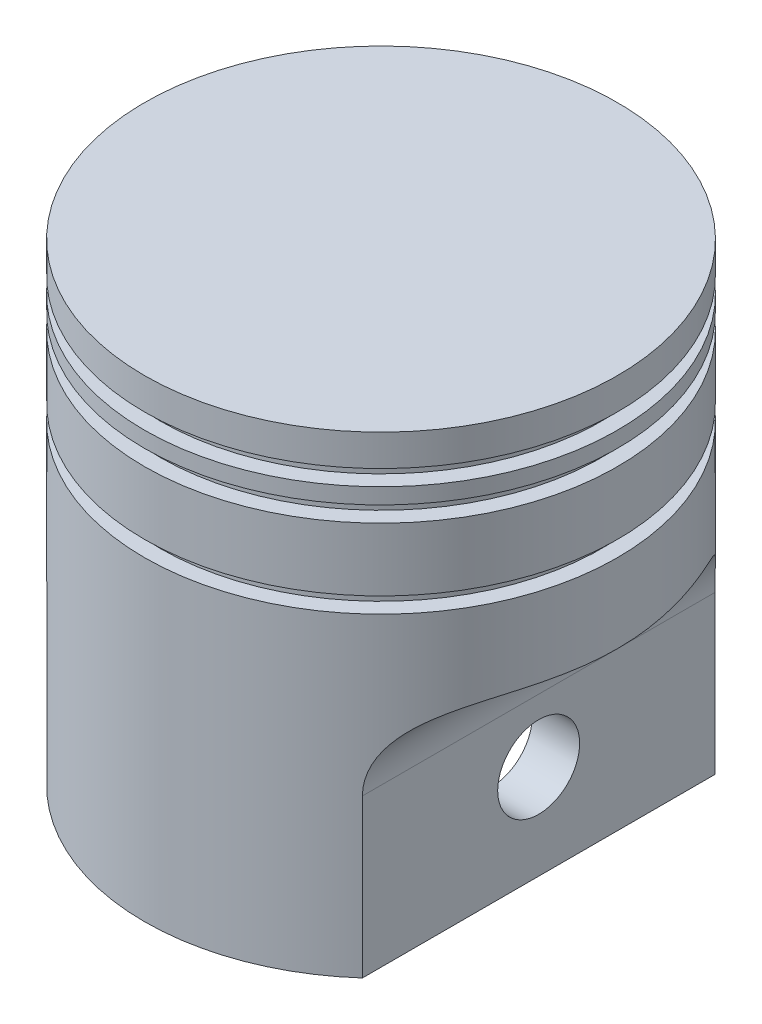
ISO-10303-21;
HEADER;
FILE_DESCRIPTION(('STEP AP214'),'2;1');
FILE_NAME('part.step','',(''),(''),'','','');
FILE_SCHEMA(('AUTOMOTIVE_DESIGN { 1 0 10303 214 1 1 1 1 }'));
ENDSEC;
DATA;
#1=APPLICATION_CONTEXT('core data for automotive mechanical design processes');
#2=APPLICATION_PROTOCOL_DEFINITION('international standard','automotive_design',2000,#1);
#3=PRODUCT_CONTEXT('',#1,'mechanical');
#4=PRODUCT('Part','Part','',(#3));
#5=PRODUCT_RELATED_PRODUCT_CATEGORY('part','',(#4));
#6=PRODUCT_DEFINITION_FORMATION('','',#4);
#7=PRODUCT_DEFINITION_CONTEXT('part definition',#1,'design');
#8=PRODUCT_DEFINITION('design','',#6,#7);
#9=PRODUCT_DEFINITION_SHAPE('','',#8);
#10=(LENGTH_UNIT() NAMED_UNIT(*) SI_UNIT(.MILLI.,.METRE.));
#11=(NAMED_UNIT(*) PLANE_ANGLE_UNIT() SI_UNIT($,.RADIAN.));
#12=(NAMED_UNIT(*) SI_UNIT($,.STERADIAN.) SOLID_ANGLE_UNIT());
#13=UNCERTAINTY_MEASURE_WITH_UNIT(LENGTH_MEASURE(1.E-05),#10,'distance_accuracy_value','');
#14=(GEOMETRIC_REPRESENTATION_CONTEXT(3) GLOBAL_UNCERTAINTY_ASSIGNED_CONTEXT((#13)) GLOBAL_UNIT_ASSIGNED_CONTEXT((#10,
#11,#12)) REPRESENTATION_CONTEXT('',''));
#15=CARTESIAN_POINT('',(0.,0.,0.));
#16=DIRECTION('',(0.,0.,1.));
#17=DIRECTION('',(1.,0.,0.));
#18=AXIS2_PLACEMENT_3D('',#15,#16,#17);
#19=CARTESIAN_POINT('',(0.,27.,0.));
#20=DIRECTION('',(0.,1.,0.));
#21=DIRECTION('',(0.,0.,1.));
#22=AXIS2_PLACEMENT_3D('',#19,#20,#21);
#23=CYLINDRICAL_SURFACE('',#22,14.);
#24=CARTESIAN_POINT('',(0.,27.,0.));
#25=DIRECTION('',(0.,1.,0.));
#26=DIRECTION('',(0.,0.,1.));
#27=AXIS2_PLACEMENT_3D('',#24,#25,#26);
#28=CIRCLE('',#27,14.);
#29=CARTESIAN_POINT('',(0.,27.,14.));
#30=VERTEX_POINT('',#29);
#31=EDGE_CURVE('E225',#30,#30,#28,.T.);
#32=ORIENTED_EDGE('',*,*,#31,.T.);
#33=EDGE_LOOP('',(#32));
#34=FACE_BOUND('',#33,.T.);
#35=CARTESIAN_POINT('',(0.,28.,0.));
#36=DIRECTION('',(0.,1.,0.));
#37=DIRECTION('',(0.,0.,1.));
#38=AXIS2_PLACEMENT_3D('',#35,#36,#37);
#39=CIRCLE('',#38,14.);
#40=CARTESIAN_POINT('',(0.,28.,14.));
#41=VERTEX_POINT('',#40);
#42=EDGE_CURVE('E216',#41,#41,#39,.T.);
#43=ORIENTED_EDGE('',*,*,#42,.F.);
#44=EDGE_LOOP('',(#43));
#45=FACE_BOUND('',#44,.T.);
#46=ADVANCED_FACE('F43',(#34,#45),#23,.T.);
#47=CARTESIAN_POINT('',(0.,26.,0.));
#48=DIRECTION('',(0.,1.,0.));
#49=DIRECTION('',(0.,0.,1.));
#50=AXIS2_PLACEMENT_3D('',#47,#48,#49);
#51=CYLINDRICAL_SURFACE('',#50,15.);
#52=CARTESIAN_POINT('',(0.,26.,0.));
#53=DIRECTION('',(0.,1.,0.));
#54=DIRECTION('',(0.,0.,1.));
#55=AXIS2_PLACEMENT_3D('',#52,#53,#54);
#56=CIRCLE('',#55,15.);
#57=CARTESIAN_POINT('',(0.,26.,15.));
#58=VERTEX_POINT('',#57);
#59=EDGE_CURVE('E240',#58,#58,#56,.T.);
#60=ORIENTED_EDGE('',*,*,#59,.T.);
#61=EDGE_LOOP('',(#60));
#62=FACE_BOUND('',#61,.T.);
#63=CARTESIAN_POINT('',(0.,27.,0.));
#64=DIRECTION('',(0.,1.,0.));
#65=DIRECTION('',(0.,0.,1.));
#66=AXIS2_PLACEMENT_3D('',#63,#64,#65);
#67=CIRCLE('',#66,15.);
#68=CARTESIAN_POINT('',(0.,27.,15.));
#69=VERTEX_POINT('',#68);
#70=EDGE_CURVE('E232',#69,#69,#67,.T.);
#71=ORIENTED_EDGE('',*,*,#70,.F.);
#72=EDGE_LOOP('',(#71));
#73=FACE_BOUND('',#72,.T.);
#74=ADVANCED_FACE('F336',(#62,#73),#51,.T.);
#75=CARTESIAN_POINT('',(0.,25.,0.));
#76=DIRECTION('',(0.,1.,0.));
#77=DIRECTION('',(0.,0.,1.));
#78=AXIS2_PLACEMENT_3D('',#75,#76,#77);
#79=CYLINDRICAL_SURFACE('',#78,14.);
#80=CARTESIAN_POINT('',(0.,25.,0.));
#81=DIRECTION('',(0.,1.,0.));
#82=DIRECTION('',(0.,0.,1.));
#83=AXIS2_PLACEMENT_3D('',#80,#81,#82);
#84=CIRCLE('',#83,14.);
#85=CARTESIAN_POINT('',(0.,25.,14.));
#86=VERTEX_POINT('',#85);
#87=EDGE_CURVE('E244',#86,#86,#84,.T.);
#88=ORIENTED_EDGE('',*,*,#87,.T.);
#89=EDGE_LOOP('',(#88));
#90=FACE_BOUND('',#89,.T.);
#91=CARTESIAN_POINT('',(0.,26.,0.));
#92=DIRECTION('',(0.,1.,0.));
#93=DIRECTION('',(0.,0.,1.));
#94=AXIS2_PLACEMENT_3D('',#91,#92,#93);
#95=CIRCLE('',#94,14.);
#96=CARTESIAN_POINT('',(0.,26.,14.));
#97=VERTEX_POINT('',#96);
#98=EDGE_CURVE('E236',#97,#97,#95,.T.);
#99=ORIENTED_EDGE('',*,*,#98,.F.);
#100=EDGE_LOOP('',(#99));
#101=FACE_BOUND('',#100,.T.);
#102=ADVANCED_FACE('F342',(#90,#101),#79,.T.);
#103=CARTESIAN_POINT('',(0.,21.,0.));
#104=DIRECTION('',(0.,1.,0.));
#105=DIRECTION('',(0.,0.,1.));
#106=AXIS2_PLACEMENT_3D('',#103,#104,#105);
#107=CYLINDRICAL_SURFACE('',#106,15.);
#108=CARTESIAN_POINT('',(0.,21.,0.));
#109=DIRECTION('',(0.,1.,0.));
#110=DIRECTION('',(0.,0.,1.));
#111=AXIS2_PLACEMENT_3D('',#108,#109,#110);
#112=CIRCLE('',#111,15.);
#113=CARTESIAN_POINT('',(0.,21.,15.));
#114=VERTEX_POINT('',#113);
#115=EDGE_CURVE('E256',#114,#114,#112,.T.);
#116=ORIENTED_EDGE('',*,*,#115,.T.);
#117=EDGE_LOOP('',(#116));
#118=FACE_BOUND('',#117,.T.);
#119=CARTESIAN_POINT('',(0.,25.,0.));
#120=DIRECTION('',(0.,1.,0.));
#121=DIRECTION('',(0.,0.,1.));
#122=AXIS2_PLACEMENT_3D('',#119,#120,#121);
#123=CIRCLE('',#122,15.);
#124=CARTESIAN_POINT('',(0.,25.,15.));
#125=VERTEX_POINT('',#124);
#126=EDGE_CURVE('E248',#125,#125,#123,.T.);
#127=ORIENTED_EDGE('',*,*,#126,.F.);
#128=EDGE_LOOP('',(#127));
#129=FACE_BOUND('',#128,.T.);
#130=ADVANCED_FACE('F361',(#118,#129),#107,.T.);
#131=CARTESIAN_POINT('',(0.,20.,0.));
#132=DIRECTION('',(0.,1.,0.));
#133=DIRECTION('',(0.,0.,1.));
#134=AXIS2_PLACEMENT_3D('',#131,#132,#133);
#135=CYLINDRICAL_SURFACE('',#134,14.);
#136=CARTESIAN_POINT('',(0.,20.,0.));
#137=DIRECTION('',(0.,1.,0.));
#138=DIRECTION('',(0.,0.,1.));
#139=AXIS2_PLACEMENT_3D('',#136,#137,#138);
#140=CIRCLE('',#139,14.);
#141=CARTESIAN_POINT('',(0.,20.,14.));
#142=VERTEX_POINT('',#141);
#143=EDGE_CURVE('E261',#142,#142,#140,.T.);
#144=ORIENTED_EDGE('',*,*,#143,.T.);
#145=EDGE_LOOP('',(#144));
#146=FACE_BOUND('',#145,.T.);
#147=CARTESIAN_POINT('',(0.,21.,0.));
#148=DIRECTION('',(0.,1.,0.));
#149=DIRECTION('',(0.,0.,1.));
#150=AXIS2_PLACEMENT_3D('',#147,#148,#149);
#151=CIRCLE('',#150,14.);
#152=CARTESIAN_POINT('',(0.,21.,14.));
#153=VERTEX_POINT('',#152);
#154=EDGE_CURVE('E252',#153,#153,#151,.T.);
#155=ORIENTED_EDGE('',*,*,#154,.F.);
#156=EDGE_LOOP('',(#155));
#157=FACE_BOUND('',#156,.T.);
#158=ADVANCED_FACE('F373',(#146,#157),#135,.T.);
#159=CARTESIAN_POINT('',(0.,30.,0.));
#160=DIRECTION('',(0.,-1.,0.));
#161=DIRECTION('',(0.,0.,-1.));
#162=AXIS2_PLACEMENT_3D('',#159,#160,#161);
#163=CYLINDRICAL_SURFACE('',#162,15.);
#164=DIRECTION('',(0.,-1.,0.));
#165=VECTOR('',#164,1.);
#166=CARTESIAN_POINT('',(-10.,30.,-11.180339887499));
#167=LINE('',#166,#165);
#168=CARTESIAN_POINT('',(-10.,0.,-11.180339887499));
#169=VERTEX_POINT('',#168);
#170=CARTESIAN_POINT('',(-10.,10.,-11.180339887499));
#171=VERTEX_POINT('',#170);
#172=EDGE_CURVE('E276',#169,#171,#167,.F.);
#173=ORIENTED_EDGE('',*,*,#172,.T.);
#174=CARTESIAN_POINT('',(-10.,10.,-11.180339887499));
#175=CARTESIAN_POINT('',(-9.99997565599701,10.1111993092333,-11.1803478124042));
#176=CARTESIAN_POINT('',(-10.0037085666472,10.2223906138013,-11.1770224635019));
#177=CARTESIAN_POINT('',(-10.0185100407903,10.4438514798812,-11.1637644984269));
#178=CARTESIAN_POINT('',(-10.0295761566512,10.5541213365173,-11.153834086847));
#179=CARTESIAN_POINT('',(-10.0587959121004,10.7723898234751,-11.127487863678));
#180=CARTESIAN_POINT('',(-10.0769156703676,10.8803967483549,-11.1111030506033));
#181=CARTESIAN_POINT('',(-10.1199097107303,11.093879673838,-11.0719590586056));
#182=CARTESIAN_POINT('',(-10.1447842434599,11.1993555803704,-11.049199643154));
#183=CARTESIAN_POINT('',(-10.2008270894416,11.4069405434256,-10.9974803677187));
#184=CARTESIAN_POINT('',(-10.2319888155767,11.509052994671,-10.9685269952689));
#185=CARTESIAN_POINT('',(-10.3000912129841,11.7094080399081,-10.9046001178019));
#186=CARTESIAN_POINT('',(-10.33703413764,11.8076491061492,-10.8696242648192));
#187=CARTESIAN_POINT('',(-10.4556821591037,12.0957592289541,-10.7559609312182));
#188=CARTESIAN_POINT('',(-10.545225384093,12.2790832004759,-10.6685206653911));
#189=CARTESIAN_POINT('',(-10.7436667476273,12.631789650879,-10.4687236611054));
#190=CARTESIAN_POINT('',(-10.8531976908455,12.8003167372623,-10.3555074075281));
#191=CARTESIAN_POINT('',(-11.0830623660803,13.113742625549,-10.1091082669942));
#192=CARTESIAN_POINT('',(-11.2034011745574,13.2586302330311,-9.97591597739786));
#193=CARTESIAN_POINT('',(-11.4203217963557,13.493580818861,-9.7260910173783));
#194=CARTESIAN_POINT('',(-11.5157960748233,13.5885078959772,-9.61298508048802));
#195=CARTESIAN_POINT('',(-11.7079391324749,13.7655546181643,-9.37801602557748));
#196=CARTESIAN_POINT('',(-11.8046083986064,13.8476688430907,-9.25614923317514));
#197=CARTESIAN_POINT('',(-11.997567817671,14.0000684363769,-9.00463956267724));
#198=CARTESIAN_POINT('',(-12.0938571688714,14.070335596837,-8.87498512299868));
#199=CARTESIAN_POINT('',(-12.2846005608556,14.1999886111455,-8.60903039807747));
#200=CARTESIAN_POINT('',(-12.3790539827797,14.2593708508505,-8.47272792442421));
#201=CARTESIAN_POINT('',(-12.6131046791401,14.3965316970471,-8.12243433112409));
#202=CARTESIAN_POINT('',(-12.7508152823734,14.4679656448217,-7.90468586923008));
#203=CARTESIAN_POINT('',(-13.0168890196464,14.5922591399893,-7.45843279627917));
#204=CARTESIAN_POINT('',(-13.1452470924153,14.6451086884634,-7.22992246978076));
#205=CARTESIAN_POINT('',(-13.3911570032563,14.7359095657273,-6.76362097433299));
#206=CARTESIAN_POINT('',(-13.5086819057701,14.7738244878829,-6.52580866056413));
#207=CARTESIAN_POINT('',(-13.7314513998452,14.8377901439596,-6.04300741296344));
#208=CARTESIAN_POINT('',(-13.8366967612395,14.863841621925,-5.79801893022829));
#209=CARTESIAN_POINT('',(-14.0091757345485,14.9014232582266,-5.36495307256899));
#210=CARTESIAN_POINT('',(-14.079284482172,14.9149602330253,-5.17818144635675));
#211=CARTESIAN_POINT('',(-14.2120698587301,14.9379850124174,-4.80176191822246));
#212=CARTESIAN_POINT('',(-14.2747457950028,14.9474724398482,-4.61211375009069));
#213=CARTESIAN_POINT('',(-14.4514265069636,14.9712473581493,-4.03929551413687));
#214=CARTESIAN_POINT('',(-14.5540441739598,14.9808398238309,-3.65235214126968));
#215=CARTESIAN_POINT('',(-14.7278867476447,14.9933457031787,-2.87210350727384));
#216=CARTESIAN_POINT('',(-14.7991598237735,14.9962693943766,-2.47880897764805));
#217=CARTESIAN_POINT('',(-14.9100636853889,14.9995021611041,-1.68796899448436));
#218=CARTESIAN_POINT('',(-14.9497153948407,14.9998129668905,-1.29042652862768));
#219=CARTESIAN_POINT('',(-14.9823059265745,14.99997299467,-0.743438803742464));
#220=CARTESIAN_POINT('',(-14.988945613787,14.9999894400308,-0.594711951186912));
#221=CARTESIAN_POINT('',(-14.9977891855319,15.0000017612852,-0.297328493152082));
#222=CARTESIAN_POINT('',(-14.9999990796937,14.9999976650728,-0.148672066407027));
#223=CARTESIAN_POINT('',(-15.,15.,0.));
#224=B_SPLINE_CURVE_WITH_KNOTS('',3,(#174,#175,#176,#177,#178,#179,#180,#181,#182,#183,#184,
#185,#186,#187,#188,#189,#190,#191,#192,#193,#194,#195,#196,#197,#198,#199,#200,#201,#202,#203,
#204,#205,#206,#207,#208,#209,#210,#211,#212,#213,#214,#215,#216,#217,#218,#219,#220,#221,#222,
#223),.UNSPECIFIED.,.F.,.F.,(4,2,2,2,2,2,2,2,2,2,2,2,2,2,2,2,2,2,2,2,2,2,2,2,4),(0.,
0.333473142708146,0.666835036830583,0.998615042230367,1.33040735991325,1.66185384594893,
1.99342984577352,2.65636670985117,3.34592324597871,4.03580537818995,4.56262937719034,
5.08967563473107,5.61752467468842,6.14554866126361,6.94635664053432,7.74759481970213,
8.55077429174956,9.35390338352502,9.95356817134691,10.5532887979478,11.7530540712473,
12.9509690824103,14.1480907699194,14.5946655256782,15.0406340296239),.UNSPECIFIED.);
#225=CARTESIAN_POINT('',(-15.,15.,0.));
#226=VERTEX_POINT('',#225);
#227=EDGE_CURVE('E11',#171,#226,#224,.T.);
#228=ORIENTED_EDGE('',*,*,#227,.T.);
#229=CARTESIAN_POINT('',(-15.,15.,0.));
#230=CARTESIAN_POINT('',(-15.0000027674631,14.9999751509739,0.209617565625922));
#231=CARTESIAN_POINT('',(-14.9956061492397,14.9999991364535,0.419234929773609));
#232=CARTESIAN_POINT('',(-14.9780339516588,14.9999661214073,0.838103171705837));
#233=CARTESIAN_POINT('',(-14.9648582973288,14.9999091201899,1.04735404634526));
#234=CARTESIAN_POINT('',(-14.9297326353317,14.9995353092622,1.4653005283991));
#235=CARTESIAN_POINT('',(-14.9077750388337,14.9992182745968,1.67399549801033));
#236=CARTESIAN_POINT('',(-14.8551254776945,14.9979705220127,2.09027771780069));
#237=CARTESIAN_POINT('',(-14.8244335711296,14.9970398081743,2.29786497533589));
#238=CARTESIAN_POINT('',(-14.7540544469088,14.9940726289193,2.71342728659697));
#239=CARTESIAN_POINT('',(-14.7142886613528,14.9920262747246,2.9213889777574));
#240=CARTESIAN_POINT('',(-14.625996824273,14.9861888341846,3.33541912398075));
#241=CARTESIAN_POINT('',(-14.5774708491015,14.9823977630454,3.54148759552819));
#242=CARTESIAN_POINT('',(-14.4717854101364,14.9723039572048,3.95122291548887));
#243=CARTESIAN_POINT('',(-14.4146306129257,14.966002577112,4.15489099826754));
#244=CARTESIAN_POINT('',(-14.2918084383066,14.9499794757418,4.55948545661232));
#245=CARTESIAN_POINT('',(-14.2261418808953,14.9402580837835,4.76041209422272));
#246=CARTESIAN_POINT('',(-14.0666259775899,14.9129531430872,5.21570301323769));
#247=CARTESIAN_POINT('',(-13.9700684986651,14.8939209904764,5.46904179504116));
#248=CARTESIAN_POINT('',(-13.7637266639418,14.8459104062024,5.96934121475423));
#249=CARTESIAN_POINT('',(-13.6539422591986,14.8169319377334,6.21630182905809));
#250=CARTESIAN_POINT('',(-13.4223985409493,14.7461333157217,6.70158382917697));
#251=CARTESIAN_POINT('',(-13.3006840255718,14.7043600393518,6.93993325825449));
#252=CARTESIAN_POINT('',(-13.0462517265084,14.6045132334209,7.40715622203951));
#253=CARTESIAN_POINT('',(-12.9135384032656,14.5464462890018,7.63603354213968));
#254=CARTESIAN_POINT('',(-12.6838162360167,14.4323744570191,8.00949767710657));
#255=CARTESIAN_POINT('',(-12.589248413754,14.3818518603149,8.15726911887295));
#256=CARTESIAN_POINT('',(-12.3969306401559,14.2704079323841,8.4466718681484));
#257=CARTESIAN_POINT('',(-12.2991815894325,14.2094895238607,8.58830488743232));
#258=CARTESIAN_POINT('',(-12.1016845325625,14.0760219167569,8.86442362508757));
#259=CARTESIAN_POINT('',(-12.0019378321413,14.0034801116028,8.99891381495299));
#260=CARTESIAN_POINT('',(-11.8019268188804,13.845590326216,9.25967396319291));
#261=CARTESIAN_POINT('',(-11.7016626586573,13.7602459343764,9.38594621077146));
#262=CARTESIAN_POINT('',(-11.4501262357414,13.5272123615156,9.6928711906204));
#263=CARTESIAN_POINT('',(-11.2996454747391,13.3702828297935,9.86736294084677));
#264=CARTESIAN_POINT('',(-11.0101631361557,13.021974729757,10.1893675913855));
#265=CARTESIAN_POINT('',(-10.8711484456694,12.8306363320486,10.3369115512679));
#266=CARTESIAN_POINT('',(-10.6353329304378,12.4477852201047,10.578921800732));
#267=CARTESIAN_POINT('',(-10.5353398193512,12.2612780787112,10.6781107010929));
#268=CARTESIAN_POINT('',(-10.4015182560002,11.9661350374956,10.8079735473173));
#269=CARTESIAN_POINT('',(-10.3596059652528,11.8651909867568,10.8481075520593));
#270=CARTESIAN_POINT('',(-10.2818565207815,11.6586954495324,10.9218264497697));
#271=CARTESIAN_POINT('',(-10.2460170024458,11.5531457766059,10.9554138926028));
#272=CARTESIAN_POINT('',(-10.1791495228189,11.3317472758129,11.0175827224958));
#273=CARTESIAN_POINT('',(-10.148530655595,11.2156583249168,11.0457513831275));
#274=CARTESIAN_POINT('',(-10.0954955911938,10.9800138106275,11.0942441308039));
#275=CARTESIAN_POINT('',(-10.0730793298693,10.8604582743522,11.1145682791958));
#276=CARTESIAN_POINT('',(-10.0368282382513,10.6180788604648,11.1473188414283));
#277=CARTESIAN_POINT('',(-10.0230567710812,10.4952375767744,11.1596869564662));
#278=CARTESIAN_POINT('',(-10.0046216347441,10.2482690619579,11.1762056281895));
#279=CARTESIAN_POINT('',(-9.99996226067655,10.1241412521104,11.1803523096115));
#280=CARTESIAN_POINT('',(-9.99999999999999,10.,11.180339887499));
#281=B_SPLINE_CURVE_WITH_KNOTS('',3,(#229,#230,#231,#232,#233,#234,#235,#236,#237,#238,#239,
#240,#241,#242,#243,#244,#245,#246,#247,#248,#249,#250,#251,#252,#253,#254,#255,#256,#257,#258,
#259,#260,#261,#262,#263,#264,#265,#266,#267,#268,#269,#270,#271,#272,#273,#274,#275,#276,#277,
#278,#279,#280),.UNSPECIFIED.,.F.,.F.,(4,2,2,2,2,2,2,2,2,2,2,2,2,2,2,2,2,2,2,2,2,2,2,2,2,4),(0.,
0.628806298726713,1.25761796751273,1.88697419598281,2.51632623982095,3.15134961921382,
3.78636746412054,4.42104310498472,5.05565764851537,5.8704593327851,6.68526403222074,
7.49711848142377,8.30864528828301,8.85599098651117,9.40318305542464,9.95002843736953,
10.4967208312954,11.3297750021383,12.16186286462,12.85974473502,13.208681272877,
13.5574816282876,13.9268787495009,14.2962729818332,14.6683440570941,15.0405904705005),.UNSPECIFIED.);
#282=CARTESIAN_POINT('',(-10.,10.,11.180339887499));
#283=VERTEX_POINT('',#282);
#284=EDGE_CURVE('E58',#226,#283,#281,.T.);
#285=ORIENTED_EDGE('',*,*,#284,.T.);
#286=DIRECTION('',(0.,-1.,0.));
#287=VECTOR('',#286,1.);
#288=CARTESIAN_POINT('',(-10.,30.,11.180339887499));
#289=LINE('',#288,#287);
#290=CARTESIAN_POINT('',(-10.,0.,11.180339887499));
#291=VERTEX_POINT('',#290);
#292=EDGE_CURVE('E279',#283,#291,#289,.T.);
#293=ORIENTED_EDGE('',*,*,#292,.T.);
#294=CARTESIAN_POINT('',(0.,0.,0.));
#295=DIRECTION('',(0.,1.,0.));
#296=DIRECTION('',(0.,0.,1.));
#297=AXIS2_PLACEMENT_3D('',#294,#295,#296);
#298=CIRCLE('',#297,15.);
#299=CARTESIAN_POINT('',(10.,0.,11.180339887499));
#300=VERTEX_POINT('',#299);
#301=EDGE_CURVE('E282',#291,#300,#298,.T.);
#302=ORIENTED_EDGE('',*,*,#301,.T.);
#303=DIRECTION('',(0.,-1.,0.));
#304=VECTOR('',#303,1.);
#305=CARTESIAN_POINT('',(10.,30.,11.180339887499));
#306=LINE('',#305,#304);
#307=CARTESIAN_POINT('',(10.,10.,11.180339887499));
#308=VERTEX_POINT('',#307);
#309=EDGE_CURVE('E270',#300,#308,#306,.F.);
#310=ORIENTED_EDGE('',*,*,#309,.T.);
#311=CARTESIAN_POINT('',(10.,10.,11.180339887499));
#312=CARTESIAN_POINT('',(9.99997565599701,10.1111993092333,11.1803478124042));
#313=CARTESIAN_POINT('',(10.0037085666472,10.2223906138013,11.1770224635019));
#314=CARTESIAN_POINT('',(10.0185100407903,10.4438514798812,11.1637644984269));
#315=CARTESIAN_POINT('',(10.0295761566512,10.5541213365173,11.153834086847));
#316=CARTESIAN_POINT('',(10.0587959121004,10.7723898234751,11.127487863678));
#317=CARTESIAN_POINT('',(10.0769156703676,10.8803967483549,11.1111030506033));
#318=CARTESIAN_POINT('',(10.1199097107303,11.093879673838,11.0719590586056));
#319=CARTESIAN_POINT('',(10.1447842434599,11.1993555803704,11.049199643154));
#320=CARTESIAN_POINT('',(10.2008270894416,11.4069405434256,10.9974803677187));
#321=CARTESIAN_POINT('',(10.2319888155767,11.509052994671,10.9685269952689));
#322=CARTESIAN_POINT('',(10.3000912129841,11.7094080399081,10.9046001178019));
#323=CARTESIAN_POINT('',(10.33703413764,11.8076491061492,10.8696242648192));
#324=CARTESIAN_POINT('',(10.4556821591037,12.0957592289541,10.7559609312182));
#325=CARTESIAN_POINT('',(10.545225384093,12.2790832004759,10.6685206653911));
#326=CARTESIAN_POINT('',(10.7436667476273,12.631789650879,10.4687236611054));
#327=CARTESIAN_POINT('',(10.8531976908455,12.8003167372623,10.3555074075281));
#328=CARTESIAN_POINT('',(11.0830623660803,13.113742625549,10.1091082669942));
#329=CARTESIAN_POINT('',(11.2034011745574,13.2586302330311,9.97591597739786));
#330=CARTESIAN_POINT('',(11.4203217963557,13.493580818861,9.7260910173783));
#331=CARTESIAN_POINT('',(11.5157960748233,13.5885078959772,9.61298508048802));
#332=CARTESIAN_POINT('',(11.7079391324749,13.7655546181643,9.37801602557748));
#333=CARTESIAN_POINT('',(11.8046083986064,13.8476688430907,9.25614923317514));
#334=CARTESIAN_POINT('',(11.997567817671,14.0000684363769,9.00463956267724));
#335=CARTESIAN_POINT('',(12.0938571688714,14.070335596837,8.87498512299868));
#336=CARTESIAN_POINT('',(12.2846005608556,14.1999886111455,8.60903039807747));
#337=CARTESIAN_POINT('',(12.3790539827797,14.2593708508505,8.47272792442421));
#338=CARTESIAN_POINT('',(12.6131046791401,14.3965316970471,8.12243433112409));
#339=CARTESIAN_POINT('',(12.7508152823734,14.4679656448217,7.90468586923008));
#340=CARTESIAN_POINT('',(13.0168890196464,14.5922591399893,7.45843279627917));
#341=CARTESIAN_POINT('',(13.1452470924153,14.6451086884634,7.22992246978076));
#342=CARTESIAN_POINT('',(13.3911570032563,14.7359095657273,6.76362097433299));
#343=CARTESIAN_POINT('',(13.5086819057701,14.7738244878829,6.52580866056413));
#344=CARTESIAN_POINT('',(13.7314513998452,14.8377901439596,6.04300741296344));
#345=CARTESIAN_POINT('',(13.8366967612395,14.863841621925,5.79801893022829));
#346=CARTESIAN_POINT('',(14.0091757345485,14.9014232582266,5.36495307256899));
#347=CARTESIAN_POINT('',(14.079284482172,14.9149602330253,5.17818144635675));
#348=CARTESIAN_POINT('',(14.2120698587301,14.9379850124174,4.80176191822246));
#349=CARTESIAN_POINT('',(14.2747457950028,14.9474724398482,4.61211375009069));
#350=CARTESIAN_POINT('',(14.4514265069636,14.9712473581493,4.03929551413687));
#351=CARTESIAN_POINT('',(14.5540441739598,14.9808398238309,3.65235214126968));
#352=CARTESIAN_POINT('',(14.7278867476447,14.9933457031787,2.87210350727384));
#353=CARTESIAN_POINT('',(14.7991598237735,14.9962693943766,2.47880897764805));
#354=CARTESIAN_POINT('',(14.9100636853889,14.9995021611041,1.68796899448436));
#355=CARTESIAN_POINT('',(14.9497153948407,14.9998129668905,1.29042652862768));
#356=CARTESIAN_POINT('',(14.9823059265745,14.99997299467,0.743438803742464));
#357=CARTESIAN_POINT('',(14.988945613787,14.9999894400308,0.594711951186912));
#358=CARTESIAN_POINT('',(14.9977891855319,15.0000017612852,0.297328493152082));
#359=CARTESIAN_POINT('',(14.9999990796937,14.9999976650728,0.148672066407027));
#360=CARTESIAN_POINT('',(15.,15.,0.));
#361=B_SPLINE_CURVE_WITH_KNOTS('',3,(#311,#312,#313,#314,#315,#316,#317,#318,#319,#320,#321,
#322,#323,#324,#325,#326,#327,#328,#329,#330,#331,#332,#333,#334,#335,#336,#337,#338,#339,#340,
#341,#342,#343,#344,#345,#346,#347,#348,#349,#350,#351,#352,#353,#354,#355,#356,#357,#358,#359,
#360),.UNSPECIFIED.,.F.,.F.,(4,2,2,2,2,2,2,2,2,2,2,2,2,2,2,2,2,2,2,2,2,2,2,2,4),(0.,
0.333473142708146,0.666835036830583,0.998615042230367,1.33040735991325,1.66185384594893,
1.99342984577352,2.65636670985117,3.34592324597871,4.03580537818995,4.56262937719034,
5.08967563473107,5.61752467468842,6.14554866126361,6.94635664053432,7.74759481970213,
8.55077429174956,9.35390338352502,9.95356817134691,10.5532887979478,11.7530540712473,
12.9509690824103,14.1480907699194,14.5946655256782,15.0406340296239),.UNSPECIFIED.);
#362=CARTESIAN_POINT('',(15.,15.,0.));
#363=VERTEX_POINT('',#362);
#364=EDGE_CURVE('E70',#308,#363,#361,.T.);
#365=ORIENTED_EDGE('',*,*,#364,.T.);
#366=CARTESIAN_POINT('',(15.,15.,0.));
#367=CARTESIAN_POINT('',(15.0000027674631,14.9999751509739,-0.209617565625922));
#368=CARTESIAN_POINT('',(14.9956061492397,14.9999991364535,-0.419234929773609));
#369=CARTESIAN_POINT('',(14.9780339516588,14.9999661214073,-0.838103171705837));
#370=CARTESIAN_POINT('',(14.9648582973288,14.9999091201899,-1.04735404634526));
#371=CARTESIAN_POINT('',(14.9297326353317,14.9995353092622,-1.4653005283991));
#372=CARTESIAN_POINT('',(14.9077750388337,14.9992182745968,-1.67399549801033));
#373=CARTESIAN_POINT('',(14.8551254776945,14.9979705220127,-2.09027771780069));
#374=CARTESIAN_POINT('',(14.8244335711296,14.9970398081743,-2.29786497533589));
#375=CARTESIAN_POINT('',(14.7540544469088,14.9940726289193,-2.71342728659697));
#376=CARTESIAN_POINT('',(14.7142886613528,14.9920262747246,-2.9213889777574));
#377=CARTESIAN_POINT('',(14.625996824273,14.9861888341846,-3.33541912398075));
#378=CARTESIAN_POINT('',(14.5774708491015,14.9823977630454,-3.54148759552819));
#379=CARTESIAN_POINT('',(14.4717854101364,14.9723039572048,-3.95122291548887));
#380=CARTESIAN_POINT('',(14.4146306129257,14.966002577112,-4.15489099826754));
#381=CARTESIAN_POINT('',(14.2918084383066,14.9499794757418,-4.55948545661232));
#382=CARTESIAN_POINT('',(14.2261418808953,14.9402580837835,-4.76041209422272));
#383=CARTESIAN_POINT('',(14.0666259775899,14.9129531430872,-5.21570301323769));
#384=CARTESIAN_POINT('',(13.9700684986651,14.8939209904764,-5.46904179504116));
#385=CARTESIAN_POINT('',(13.7637266639418,14.8459104062024,-5.96934121475423));
#386=CARTESIAN_POINT('',(13.6539422591986,14.8169319377334,-6.21630182905809));
#387=CARTESIAN_POINT('',(13.4223985409493,14.7461333157217,-6.70158382917697));
#388=CARTESIAN_POINT('',(13.3006840255718,14.7043600393518,-6.93993325825449));
#389=CARTESIAN_POINT('',(13.0462517265084,14.6045132334209,-7.40715622203951));
#390=CARTESIAN_POINT('',(12.9135384032656,14.5464462890018,-7.63603354213968));
#391=CARTESIAN_POINT('',(12.6838162360167,14.4323744570191,-8.00949767710657));
#392=CARTESIAN_POINT('',(12.589248413754,14.3818518603149,-8.15726911887295));
#393=CARTESIAN_POINT('',(12.3969306401559,14.2704079323841,-8.4466718681484));
#394=CARTESIAN_POINT('',(12.2991815894325,14.2094895238607,-8.58830488743232));
#395=CARTESIAN_POINT('',(12.1016845325625,14.0760219167569,-8.86442362508757));
#396=CARTESIAN_POINT('',(12.0019378321413,14.0034801116028,-8.99891381495299));
#397=CARTESIAN_POINT('',(11.8019268188804,13.845590326216,-9.25967396319291));
#398=CARTESIAN_POINT('',(11.7016626586573,13.7602459343764,-9.38594621077146));
#399=CARTESIAN_POINT('',(11.4501262357414,13.5272123615156,-9.6928711906204));
#400=CARTESIAN_POINT('',(11.2996454747391,13.3702828297935,-9.86736294084677));
#401=CARTESIAN_POINT('',(11.0101631361557,13.021974729757,-10.1893675913855));
#402=CARTESIAN_POINT('',(10.8711484456694,12.8306363320486,-10.3369115512679));
#403=CARTESIAN_POINT('',(10.6353329304378,12.4477852201047,-10.578921800732));
#404=CARTESIAN_POINT('',(10.5353398193512,12.2612780787112,-10.6781107010929));
#405=CARTESIAN_POINT('',(10.4015182560002,11.9661350374956,-10.8079735473173));
#406=CARTESIAN_POINT('',(10.3596059652528,11.8651909867568,-10.8481075520593));
#407=CARTESIAN_POINT('',(10.2818565207815,11.6586954495324,-10.9218264497697));
#408=CARTESIAN_POINT('',(10.2460170024458,11.5531457766059,-10.9554138926028));
#409=CARTESIAN_POINT('',(10.1791495228189,11.3317472758129,-11.0175827224958));
#410=CARTESIAN_POINT('',(10.148530655595,11.2156583249168,-11.0457513831275));
#411=CARTESIAN_POINT('',(10.0954955911938,10.9800138106275,-11.0942441308039));
#412=CARTESIAN_POINT('',(10.0730793298693,10.8604582743522,-11.1145682791958));
#413=CARTESIAN_POINT('',(10.0368282382513,10.6180788604648,-11.1473188414283));
#414=CARTESIAN_POINT('',(10.0230567710812,10.4952375767744,-11.1596869564662));
#415=CARTESIAN_POINT('',(10.0046216347441,10.2482690619579,-11.1762056281895));
#416=CARTESIAN_POINT('',(9.99996226067655,10.1241412521104,-11.1803523096115));
#417=CARTESIAN_POINT('',(9.99999999999999,10.,-11.180339887499));
#418=B_SPLINE_CURVE_WITH_KNOTS('',3,(#366,#367,#368,#369,#370,#371,#372,#373,#374,#375,#376,
#377,#378,#379,#380,#381,#382,#383,#384,#385,#386,#387,#388,#389,#390,#391,#392,#393,#394,#395,
#396,#397,#398,#399,#400,#401,#402,#403,#404,#405,#406,#407,#408,#409,#410,#411,#412,#413,#414,
#415,#416,#417),.UNSPECIFIED.,.F.,.F.,(4,2,2,2,2,2,2,2,2,2,2,2,2,2,2,2,2,2,2,2,2,2,2,2,2,4),(0.,
0.628806298726713,1.25761796751273,1.88697419598281,2.51632623982095,3.15134961921382,
3.78636746412054,4.42104310498472,5.05565764851537,5.8704593327851,6.68526403222074,
7.49711848142377,8.30864528828301,8.85599098651117,9.40318305542464,9.95002843736953,
10.4967208312954,11.3297750021383,12.16186286462,12.85974473502,13.208681272877,
13.5574816282876,13.9268787495009,14.2962729818332,14.6683440570941,15.0405904705005),.UNSPECIFIED.);
#419=CARTESIAN_POINT('',(10.,10.,-11.180339887499));
#420=VERTEX_POINT('',#419);
#421=EDGE_CURVE('E312',#363,#420,#418,.T.);
#422=ORIENTED_EDGE('',*,*,#421,.T.);
#423=DIRECTION('',(0.,-1.,0.));
#424=VECTOR('',#423,1.);
#425=CARTESIAN_POINT('',(10.,30.,-11.180339887499));
#426=LINE('',#425,#424);
#427=CARTESIAN_POINT('',(10.,0.,-11.180339887499));
#428=VERTEX_POINT('',#427);
#429=EDGE_CURVE('E273',#420,#428,#426,.T.);
#430=ORIENTED_EDGE('',*,*,#429,.T.);
#431=EDGE_CURVE('E286',#428,#169,#298,.T.);
#432=ORIENTED_EDGE('',*,*,#431,.T.);
#433=EDGE_LOOP('',(#173,#228,#285,#293,#302,#310,#365,#422,#430,#432));
#434=FACE_BOUND('',#433,.T.);
#435=CARTESIAN_POINT('',(0.,20.,0.));
#436=DIRECTION('',(0.,1.,0.));
#437=DIRECTION('',(0.,0.,1.));
#438=AXIS2_PLACEMENT_3D('',#435,#436,#437);
#439=CIRCLE('',#438,15.);
#440=CARTESIAN_POINT('',(0.,20.,15.));
#441=VERTEX_POINT('',#440);
#442=EDGE_CURVE('E260',#441,#441,#439,.T.);
#443=ORIENTED_EDGE('',*,*,#442,.F.);
#444=EDGE_LOOP('',(#443));
#445=FACE_BOUND('',#444,.T.);
#446=ADVANCED_FACE('F317',(#434,#445),#163,.T.);
#447=CARTESIAN_POINT('',(0.,0.,0.));
#448=DIRECTION('',(0.,1.,0.));
#449=DIRECTION('',(0.,0.,1.));
#450=AXIS2_PLACEMENT_3D('',#447,#448,#449);
#451=PLANE('',#450);
#452=DIRECTION('',(0.,0.,-1.));
#453=VECTOR('',#452,1.);
#454=CARTESIAN_POINT('',(-7.,0.,0.));
#455=LINE('',#454,#453);
#456=CARTESIAN_POINT('',(-7.,0.,9.74679434480896));
#457=VERTEX_POINT('',#456);
#458=CARTESIAN_POINT('',(-7.,0.,-9.74679434480896));
#459=VERTEX_POINT('',#458);
#460=EDGE_CURVE('E147',#457,#459,#455,.T.);
#461=ORIENTED_EDGE('',*,*,#460,.F.);
#462=CARTESIAN_POINT('',(0.,0.,0.));
#463=DIRECTION('',(0.,1.,0.));
#464=DIRECTION('',(0.,0.,1.));
#465=AXIS2_PLACEMENT_3D('',#462,#463,#464);
#466=CIRCLE('',#465,12.);
#467=CARTESIAN_POINT('',(7.,0.,9.74679434480896));
#468=VERTEX_POINT('',#467);
#469=EDGE_CURVE('E155',#457,#468,#466,.T.);
#470=ORIENTED_EDGE('',*,*,#469,.T.);
#471=DIRECTION('',(0.,0.,1.));
#472=VECTOR('',#471,1.);
#473=CARTESIAN_POINT('',(7.,0.,0.));
#474=LINE('',#473,#472);
#475=CARTESIAN_POINT('',(7.,0.,-9.74679434480896));
#476=VERTEX_POINT('',#475);
#477=EDGE_CURVE('E172',#476,#468,#474,.T.);
#478=ORIENTED_EDGE('',*,*,#477,.F.);
#479=CARTESIAN_POINT('',(0.,0.,0.));
#480=DIRECTION('',(0.,1.,0.));
#481=DIRECTION('',(0.,0.,1.));
#482=AXIS2_PLACEMENT_3D('',#479,#480,#481);
#483=CIRCLE('',#482,12.);
#484=EDGE_CURVE('E166',#476,#459,#483,.T.);
#485=ORIENTED_EDGE('',*,*,#484,.T.);
#486=EDGE_LOOP('',(#461,#470,#478,#485));
#487=FACE_BOUND('',#486,.T.);
#488=ORIENTED_EDGE('',*,*,#301,.F.);
#489=DIRECTION('',(0.,0.,-1.));
#490=VECTOR('',#489,1.);
#491=CARTESIAN_POINT('',(-10.,0.,0.));
#492=LINE('',#491,#490);
#493=EDGE_CURVE('E266',#291,#169,#492,.T.);
#494=ORIENTED_EDGE('',*,*,#493,.T.);
#495=ORIENTED_EDGE('',*,*,#431,.F.);
#496=DIRECTION('',(0.,0.,1.));
#497=VECTOR('',#496,1.);
#498=CARTESIAN_POINT('',(10.,0.,0.));
#499=LINE('',#498,#497);
#500=EDGE_CURVE('E287',#428,#300,#499,.T.);
#501=ORIENTED_EDGE('',*,*,#500,.T.);
#502=EDGE_LOOP('',(#488,#494,#495,#501));
#503=FACE_BOUND('',#502,.T.);
#504=ADVANCED_FACE('F168',(#487,#503),#451,.F.);
#505=CARTESIAN_POINT('',(10.,0.,-15.));
#506=DIRECTION('',(-1.,0.,0.));
#507=DIRECTION('',(0.,0.,1.));
#508=AXIS2_PLACEMENT_3D('',#505,#506,#507);
#509=PLANE('',#508);
#510=CARTESIAN_POINT('',(10.,6.,0.));
#511=DIRECTION('',(-1.,0.,0.));
#512=DIRECTION('',(0.,0.,1.));
#513=AXIS2_PLACEMENT_3D('',#510,#511,#512);
#514=CIRCLE('',#513,2.6);
#515=CARTESIAN_POINT('',(10.,6.,2.6));
#516=VERTEX_POINT('',#515);
#517=EDGE_CURVE('E429',#516,#516,#514,.T.);
#518=ORIENTED_EDGE('',*,*,#517,.T.);
#519=EDGE_LOOP('',(#518));
#520=FACE_BOUND('',#519,.T.);
#521=ORIENTED_EDGE('',*,*,#429,.F.);
#522=DIRECTION('',(0.,0.,1.));
#523=VECTOR('',#522,1.);
#524=CARTESIAN_POINT('',(10.,10.,11.180339887499));
#525=LINE('',#524,#523);
#526=EDGE_CURVE('E265',#420,#308,#525,.T.);
#527=ORIENTED_EDGE('',*,*,#526,.T.);
#528=ORIENTED_EDGE('',*,*,#309,.F.);
#529=ORIENTED_EDGE('',*,*,#500,.F.);
#530=EDGE_LOOP('',(#521,#527,#528,#529));
#531=FACE_BOUND('',#530,.T.);
#532=ADVANCED_FACE('F390',(#520,#531),#509,.F.);
#533=CARTESIAN_POINT('',(-10.,0.,-15.));
#534=DIRECTION('',(1.,0.,0.));
#535=DIRECTION('',(0.,0.,-1.));
#536=AXIS2_PLACEMENT_3D('',#533,#534,#535);
#537=PLANE('',#536);
#538=CARTESIAN_POINT('',(-10.,6.,0.));
#539=DIRECTION('',(1.,0.,0.));
#540=DIRECTION('',(0.,0.,-1.));
#541=AXIS2_PLACEMENT_3D('',#538,#539,#540);
#542=CIRCLE('',#541,2.6);
#543=CARTESIAN_POINT('',(-10.,6.,-2.6));
#544=VERTEX_POINT('',#543);
#545=EDGE_CURVE('E697',#544,#544,#542,.T.);
#546=ORIENTED_EDGE('',*,*,#545,.T.);
#547=EDGE_LOOP('',(#546));
#548=FACE_BOUND('',#547,.T.);
#549=ORIENTED_EDGE('',*,*,#292,.F.);
#550=DIRECTION('',(0.,0.,1.));
#551=VECTOR('',#550,1.);
#552=CARTESIAN_POINT('',(-10.,10.,-11.180339887499));
#553=LINE('',#552,#551);
#554=EDGE_CURVE('E302',#283,#171,#553,.F.);
#555=ORIENTED_EDGE('',*,*,#554,.T.);
#556=ORIENTED_EDGE('',*,*,#172,.F.);
#557=ORIENTED_EDGE('',*,*,#493,.F.);
#558=EDGE_LOOP('',(#549,#555,#556,#557));
#559=FACE_BOUND('',#558,.T.);
#560=ADVANCED_FACE('F386',(#548,#559),#537,.F.);
#561=CARTESIAN_POINT('',(0.,20.,0.));
#562=DIRECTION('',(0.,1.,0.));
#563=DIRECTION('',(0.,0.,1.));
#564=AXIS2_PLACEMENT_3D('',#561,#562,#563);
#565=PLANE('',#564);
#566=ORIENTED_EDGE('',*,*,#143,.F.);
#567=EDGE_LOOP('',(#566));
#568=FACE_BOUND('',#567,.T.);
#569=ORIENTED_EDGE('',*,*,#442,.T.);
#570=EDGE_LOOP('',(#569));
#571=FACE_BOUND('',#570,.T.);
#572=ADVANCED_FACE('F369',(#568,#571),#565,.T.);
#573=CARTESIAN_POINT('',(0.,21.,0.));
#574=DIRECTION('',(0.,1.,0.));
#575=DIRECTION('',(0.,0.,1.));
#576=AXIS2_PLACEMENT_3D('',#573,#574,#575);
#577=PLANE('',#576);
#578=ORIENTED_EDGE('',*,*,#154,.T.);
#579=EDGE_LOOP('',(#578));
#580=FACE_BOUND('',#579,.T.);
#581=ORIENTED_EDGE('',*,*,#115,.F.);
#582=EDGE_LOOP('',(#581));
#583=FACE_BOUND('',#582,.T.);
#584=ADVANCED_FACE('F365',(#580,#583),#577,.F.);
#585=CARTESIAN_POINT('',(0.,25.,0.));
#586=DIRECTION('',(0.,1.,0.));
#587=DIRECTION('',(0.,0.,1.));
#588=AXIS2_PLACEMENT_3D('',#585,#586,#587);
#589=PLANE('',#588);
#590=ORIENTED_EDGE('',*,*,#87,.F.);
#591=EDGE_LOOP('',(#590));
#592=FACE_BOUND('',#591,.T.);
#593=ORIENTED_EDGE('',*,*,#126,.T.);
#594=EDGE_LOOP('',(#593));
#595=FACE_BOUND('',#594,.T.);
#596=ADVANCED_FACE('F356',(#592,#595),#589,.T.);
#597=CARTESIAN_POINT('',(0.,26.,0.));
#598=DIRECTION('',(0.,1.,0.));
#599=DIRECTION('',(0.,0.,1.));
#600=AXIS2_PLACEMENT_3D('',#597,#598,#599);
#601=PLANE('',#600);
#602=ORIENTED_EDGE('',*,*,#98,.T.);
#603=EDGE_LOOP('',(#602));
#604=FACE_BOUND('',#603,.T.);
#605=ORIENTED_EDGE('',*,*,#59,.F.);
#606=EDGE_LOOP('',(#605));
#607=FACE_BOUND('',#606,.T.);
#608=ADVANCED_FACE('F353',(#604,#607),#601,.F.);
#609=CARTESIAN_POINT('',(0.,27.,0.));
#610=DIRECTION('',(0.,1.,0.));
#611=DIRECTION('',(0.,0.,1.));
#612=AXIS2_PLACEMENT_3D('',#609,#610,#611);
#613=PLANE('',#612);
#614=ORIENTED_EDGE('',*,*,#31,.F.);
#615=EDGE_LOOP('',(#614));
#616=FACE_BOUND('',#615,.T.);
#617=ORIENTED_EDGE('',*,*,#70,.T.);
#618=EDGE_LOOP('',(#617));
#619=FACE_BOUND('',#618,.T.);
#620=ADVANCED_FACE('F350',(#616,#619),#613,.T.);
#621=CARTESIAN_POINT('',(0.,28.,0.));
#622=DIRECTION('',(0.,1.,0.));
#623=DIRECTION('',(0.,0.,1.));
#624=AXIS2_PLACEMENT_3D('',#621,#622,#623);
#625=CYLINDRICAL_SURFACE('',#624,15.);
#626=CARTESIAN_POINT('',(0.,28.,0.));
#627=DIRECTION('',(0.,1.,0.));
#628=DIRECTION('',(0.,0.,1.));
#629=AXIS2_PLACEMENT_3D('',#626,#627,#628);
#630=CIRCLE('',#629,15.);
#631=CARTESIAN_POINT('',(0.,28.,15.));
#632=VERTEX_POINT('',#631);
#633=EDGE_CURVE('E221',#632,#632,#630,.T.);
#634=ORIENTED_EDGE('',*,*,#633,.T.);
#635=EDGE_LOOP('',(#634));
#636=FACE_BOUND('',#635,.T.);
#637=CARTESIAN_POINT('',(0.,30.,0.));
#638=DIRECTION('',(0.,1.,0.));
#639=DIRECTION('',(0.,0.,1.));
#640=AXIS2_PLACEMENT_3D('',#637,#638,#639);
#641=CIRCLE('',#640,15.);
#642=CARTESIAN_POINT('',(0.,30.,15.));
#643=VERTEX_POINT('',#642);
#644=EDGE_CURVE('E220',#643,#643,#641,.T.);
#645=ORIENTED_EDGE('',*,*,#644,.F.);
#646=EDGE_LOOP('',(#645));
#647=FACE_BOUND('',#646,.T.);
#648=ADVANCED_FACE('F348',(#636,#647),#625,.T.);
#649=CARTESIAN_POINT('',(0.,28.,0.));
#650=DIRECTION('',(0.,1.,0.));
#651=DIRECTION('',(0.,0.,1.));
#652=AXIS2_PLACEMENT_3D('',#649,#650,#651);
#653=PLANE('',#652);
#654=ORIENTED_EDGE('',*,*,#42,.T.);
#655=EDGE_LOOP('',(#654));
#656=FACE_BOUND('',#655,.T.);
#657=ORIENTED_EDGE('',*,*,#633,.F.);
#658=EDGE_LOOP('',(#657));
#659=FACE_BOUND('',#658,.T.);
#660=ADVANCED_FACE('F379',(#656,#659),#653,.F.);
#661=CARTESIAN_POINT('',(0.,30.,0.));
#662=DIRECTION('',(0.,1.,0.));
#663=DIRECTION('',(0.,0.,1.));
#664=AXIS2_PLACEMENT_3D('',#661,#662,#663);
#665=PLANE('',#664);
#666=ORIENTED_EDGE('',*,*,#644,.T.);
#667=EDGE_LOOP('',(#666));
#668=FACE_BOUND('',#667,.T.);
#669=ADVANCED_FACE('F375',(#668),#665,.T.);
#670=CARTESIAN_POINT('',(0.,25.,0.));
#671=DIRECTION('',(0.,1.,0.));
#672=DIRECTION('',(0.,0.,1.));
#673=AXIS2_PLACEMENT_3D('',#670,#671,#672);
#674=CYLINDRICAL_SURFACE('',#673,11.);
#675=DIRECTION('',(0.,1.,0.));
#676=VECTOR('',#675,1.);
#677=CARTESIAN_POINT('',(7.,20.,8.48528137423857));
#678=LINE('',#677,#676);
#679=CARTESIAN_POINT('',(7.,18.,8.48528137423857));
#680=VERTEX_POINT('',#679);
#681=CARTESIAN_POINT('',(7.,17.,8.48528137423857));
#682=VERTEX_POINT('',#681);
#683=EDGE_CURVE('E200',#680,#682,#678,.F.);
#684=ORIENTED_EDGE('',*,*,#683,.T.);
#685=CARTESIAN_POINT('',(0.,17.,0.));
#686=DIRECTION('',(0.,1.,0.));
#687=DIRECTION('',(0.,0.,1.));
#688=AXIS2_PLACEMENT_3D('',#685,#686,#687);
#689=CIRCLE('',#688,11.);
#690=CARTESIAN_POINT('',(-7.,17.,8.48528137423857));
#691=VERTEX_POINT('',#690);
#692=EDGE_CURVE('E177',#691,#682,#689,.T.);
#693=ORIENTED_EDGE('',*,*,#692,.F.);
#694=DIRECTION('',(0.,1.,0.));
#695=VECTOR('',#694,1.);
#696=CARTESIAN_POINT('',(-7.,20.,8.48528137423857));
#697=LINE('',#696,#695);
#698=CARTESIAN_POINT('',(-7.,18.,8.48528137423857));
#699=VERTEX_POINT('',#698);
#700=EDGE_CURVE('E191',#699,#691,#697,.F.);
#701=ORIENTED_EDGE('',*,*,#700,.F.);
#702=CARTESIAN_POINT('',(0.,18.,0.));
#703=DIRECTION('',(0.,1.,0.));
#704=DIRECTION('',(0.,0.,1.));
#705=AXIS2_PLACEMENT_3D('',#702,#703,#704);
#706=CIRCLE('',#705,11.);
#707=CARTESIAN_POINT('',(-7.,18.,-8.48528137423857));
#708=VERTEX_POINT('',#707);
#709=EDGE_CURVE('E204',#699,#708,#706,.F.);
#710=ORIENTED_EDGE('',*,*,#709,.T.);
#711=DIRECTION('',(0.,1.,0.));
#712=VECTOR('',#711,1.);
#713=CARTESIAN_POINT('',(-7.,20.,-8.48528137423857));
#714=LINE('',#713,#712);
#715=CARTESIAN_POINT('',(-7.,17.,-8.48528137423857));
#716=VERTEX_POINT('',#715);
#717=EDGE_CURVE('E194',#716,#708,#714,.T.);
#718=ORIENTED_EDGE('',*,*,#717,.F.);
#719=CARTESIAN_POINT('',(7.,17.,-8.48528137423857));
#720=VERTEX_POINT('',#719);
#721=EDGE_CURVE('E171',#720,#716,#689,.T.);
#722=ORIENTED_EDGE('',*,*,#721,.F.);
#723=DIRECTION('',(0.,1.,0.));
#724=VECTOR('',#723,1.);
#725=CARTESIAN_POINT('',(7.,20.,-8.48528137423857));
#726=LINE('',#725,#724);
#727=CARTESIAN_POINT('',(7.,18.,-8.48528137423857));
#728=VERTEX_POINT('',#727);
#729=EDGE_CURVE('E197',#720,#728,#726,.T.);
#730=ORIENTED_EDGE('',*,*,#729,.T.);
#731=CARTESIAN_POINT('',(0.,18.,0.));
#732=DIRECTION('',(0.,1.,0.));
#733=DIRECTION('',(0.,0.,1.));
#734=AXIS2_PLACEMENT_3D('',#731,#732,#733);
#735=CIRCLE('',#734,11.);
#736=EDGE_CURVE('E208',#680,#728,#735,.T.);
#737=ORIENTED_EDGE('',*,*,#736,.F.);
#738=EDGE_LOOP('',(#684,#693,#701,#710,#718,#722,#730,#737));
#739=FACE_BOUND('',#738,.T.);
#740=CARTESIAN_POINT('',(0.,27.,0.));
#741=DIRECTION('',(0.,1.,0.));
#742=DIRECTION('',(0.,0.,1.));
#743=AXIS2_PLACEMENT_3D('',#740,#741,#742);
#744=CIRCLE('',#743,11.);
#745=CARTESIAN_POINT('',(0.,27.,11.));
#746=VERTEX_POINT('',#745);
#747=EDGE_CURVE('E212',#746,#746,#744,.F.);
#748=ORIENTED_EDGE('',*,*,#747,.F.);
#749=EDGE_LOOP('',(#748));
#750=FACE_BOUND('',#749,.T.);
#751=ADVANCED_FACE('F378',(#739,#750),#674,.F.);
#752=CARTESIAN_POINT('',(-7.,0.,-15.));
#753=DIRECTION('',(1.,0.,0.));
#754=DIRECTION('',(0.,0.,-1.));
#755=AXIS2_PLACEMENT_3D('',#752,#753,#754);
#756=PLANE('',#755);
#757=CARTESIAN_POINT('',(-7.,6.,0.));
#758=DIRECTION('',(1.,0.,0.));
#759=DIRECTION('',(0.,0.,-1.));
#760=AXIS2_PLACEMENT_3D('',#757,#758,#759);
#761=CIRCLE('',#760,2.6);
#762=CARTESIAN_POINT('',(-7.,6.,-2.6));
#763=VERTEX_POINT('',#762);
#764=EDGE_CURVE('E298',#763,#763,#761,.T.);
#765=ORIENTED_EDGE('',*,*,#764,.F.);
#766=EDGE_LOOP('',(#765));
#767=FACE_BOUND('',#766,.T.);
#768=ORIENTED_EDGE('',*,*,#717,.T.);
#769=DIRECTION('',(0.,0.,1.));
#770=VECTOR('',#769,1.);
#771=CARTESIAN_POINT('',(-7.,18.,-15.));
#772=LINE('',#771,#770);
#773=EDGE_CURVE('E440',#708,#699,#772,.T.);
#774=ORIENTED_EDGE('',*,*,#773,.T.);
#775=ORIENTED_EDGE('',*,*,#700,.T.);
#776=DIRECTION('',(0.,0.,1.));
#777=VECTOR('',#776,1.);
#778=CARTESIAN_POINT('',(-7.,17.,-15.));
#779=LINE('',#778,#777);
#780=CARTESIAN_POINT('',(-7.,17.,9.74679434480896));
#781=VERTEX_POINT('',#780);
#782=EDGE_CURVE('E150',#691,#781,#779,.T.);
#783=ORIENTED_EDGE('',*,*,#782,.T.);
#784=DIRECTION('',(0.,-1.,0.));
#785=VECTOR('',#784,1.);
#786=CARTESIAN_POINT('',(-7.,18.,9.74679434480896));
#787=LINE('',#786,#785);
#788=EDGE_CURVE('E142',#781,#457,#787,.T.);
#789=ORIENTED_EDGE('',*,*,#788,.T.);
#790=ORIENTED_EDGE('',*,*,#460,.T.);
#791=DIRECTION('',(0.,-1.,0.));
#792=VECTOR('',#791,1.);
#793=CARTESIAN_POINT('',(-7.,0.,-9.74679434480896));
#794=LINE('',#793,#792);
#795=CARTESIAN_POINT('',(-7.,17.,-9.74679434480896));
#796=VERTEX_POINT('',#795);
#797=EDGE_CURVE('E156',#459,#796,#794,.F.);
#798=ORIENTED_EDGE('',*,*,#797,.T.);
#799=EDGE_CURVE('E186',#796,#716,#779,.T.);
#800=ORIENTED_EDGE('',*,*,#799,.T.);
#801=EDGE_LOOP('',(#768,#774,#775,#783,#789,#790,#798,#800));
#802=FACE_BOUND('',#801,.T.);
#803=ADVANCED_FACE('F144',(#767,#802),#756,.T.);
#804=CARTESIAN_POINT('',(0.,17.,0.));
#805=DIRECTION('',(0.,1.,0.));
#806=DIRECTION('',(0.,0.,1.));
#807=AXIS2_PLACEMENT_3D('',#804,#805,#806);
#808=PLANE('',#807);
#809=DIRECTION('',(0.,0.,1.));
#810=VECTOR('',#809,1.);
#811=CARTESIAN_POINT('',(7.,17.,0.));
#812=LINE('',#811,#810);
#813=CARTESIAN_POINT('',(7.,17.,-9.74679434480896));
#814=VERTEX_POINT('',#813);
#815=EDGE_CURVE('E190',#814,#720,#812,.T.);
#816=ORIENTED_EDGE('',*,*,#815,.T.);
#817=ORIENTED_EDGE('',*,*,#721,.T.);
#818=ORIENTED_EDGE('',*,*,#799,.F.);
#819=CARTESIAN_POINT('',(0.,17.,0.));
#820=DIRECTION('',(0.,1.,0.));
#821=DIRECTION('',(0.,0.,1.));
#822=AXIS2_PLACEMENT_3D('',#819,#820,#821);
#823=CIRCLE('',#822,12.);
#824=EDGE_CURVE('E431',#814,#796,#823,.T.);
#825=ORIENTED_EDGE('',*,*,#824,.F.);
#826=EDGE_LOOP('',(#816,#817,#818,#825));
#827=FACE_BOUND('',#826,.T.);
#828=ADVANCED_FACE('F481',(#827),#808,.F.);
#829=CARTESIAN_POINT('',(0.,30.,0.));
#830=DIRECTION('',(0.,-1.,0.));
#831=DIRECTION('',(0.,0.,-1.));
#832=AXIS2_PLACEMENT_3D('',#829,#830,#831);
#833=CYLINDRICAL_SURFACE('',#832,12.);
#834=DIRECTION('',(0.,-1.,0.));
#835=VECTOR('',#834,1.);
#836=CARTESIAN_POINT('',(7.,0.,9.74679434480896));
#837=LINE('',#836,#835);
#838=CARTESIAN_POINT('',(7.,17.,9.74679434480896));
#839=VERTEX_POINT('',#838);
#840=EDGE_CURVE('E161',#468,#839,#837,.F.);
#841=ORIENTED_EDGE('',*,*,#840,.F.);
#842=ORIENTED_EDGE('',*,*,#469,.F.);
#843=ORIENTED_EDGE('',*,*,#788,.F.);
#844=EDGE_CURVE('E435',#781,#839,#823,.T.);
#845=ORIENTED_EDGE('',*,*,#844,.T.);
#846=EDGE_LOOP('',(#841,#842,#843,#845));
#847=FACE_BOUND('',#846,.T.);
#848=ADVANCED_FACE('F159',(#847),#833,.F.);
#849=ORIENTED_EDGE('',*,*,#824,.T.);
#850=ORIENTED_EDGE('',*,*,#797,.F.);
#851=ORIENTED_EDGE('',*,*,#484,.F.);
#852=DIRECTION('',(0.,-1.,0.));
#853=VECTOR('',#852,1.);
#854=CARTESIAN_POINT('',(7.,18.,-9.74679434480896));
#855=LINE('',#854,#853);
#856=EDGE_CURVE('E439',#814,#476,#855,.T.);
#857=ORIENTED_EDGE('',*,*,#856,.F.);
#858=EDGE_LOOP('',(#849,#850,#851,#857));
#859=FACE_BOUND('',#858,.T.);
#860=ADVANCED_FACE('F464',(#859),#833,.F.);
#861=CARTESIAN_POINT('',(10.,18.,-15.));
#862=DIRECTION('',(0.,1.,0.));
#863=DIRECTION('',(0.,0.,1.));
#864=AXIS2_PLACEMENT_3D('',#861,#862,#863);
#865=PLANE('',#864);
#866=ORIENTED_EDGE('',*,*,#736,.T.);
#867=DIRECTION('',(0.,0.,1.));
#868=VECTOR('',#867,1.);
#869=CARTESIAN_POINT('',(7.,18.,-15.));
#870=LINE('',#869,#868);
#871=EDGE_CURVE('E434',#728,#680,#870,.T.);
#872=ORIENTED_EDGE('',*,*,#871,.T.);
#873=EDGE_LOOP('',(#866,#872));
#874=FACE_BOUND('',#873,.T.);
#875=ADVANCED_FACE('F462',(#874),#865,.T.);
#876=CARTESIAN_POINT('',(7.,0.,-15.));
#877=DIRECTION('',(-1.,0.,0.));
#878=DIRECTION('',(0.,0.,1.));
#879=AXIS2_PLACEMENT_3D('',#876,#877,#878);
#880=PLANE('',#879);
#881=CARTESIAN_POINT('',(7.,6.,0.));
#882=DIRECTION('',(-1.,0.,0.));
#883=DIRECTION('',(0.,0.,1.));
#884=AXIS2_PLACEMENT_3D('',#881,#882,#883);
#885=CIRCLE('',#884,2.6);
#886=CARTESIAN_POINT('',(7.,6.,2.6));
#887=VERTEX_POINT('',#886);
#888=EDGE_CURVE('E294',#887,#887,#885,.T.);
#889=ORIENTED_EDGE('',*,*,#888,.F.);
#890=EDGE_LOOP('',(#889));
#891=FACE_BOUND('',#890,.T.);
#892=ORIENTED_EDGE('',*,*,#871,.F.);
#893=ORIENTED_EDGE('',*,*,#729,.F.);
#894=ORIENTED_EDGE('',*,*,#815,.F.);
#895=ORIENTED_EDGE('',*,*,#856,.T.);
#896=ORIENTED_EDGE('',*,*,#477,.T.);
#897=ORIENTED_EDGE('',*,*,#840,.T.);
#898=EDGE_CURVE('E187',#682,#839,#812,.T.);
#899=ORIENTED_EDGE('',*,*,#898,.F.);
#900=ORIENTED_EDGE('',*,*,#683,.F.);
#901=EDGE_LOOP('',(#892,#893,#894,#895,#896,#897,#899,#900));
#902=FACE_BOUND('',#901,.T.);
#903=ADVANCED_FACE('F459',(#891,#902),#880,.T.);
#904=CARTESIAN_POINT('',(-10.,18.,-15.));
#905=DIRECTION('',(0.,1.,0.));
#906=DIRECTION('',(0.,0.,1.));
#907=AXIS2_PLACEMENT_3D('',#904,#905,#906);
#908=PLANE('',#907);
#909=ORIENTED_EDGE('',*,*,#773,.F.);
#910=ORIENTED_EDGE('',*,*,#709,.F.);
#911=EDGE_LOOP('',(#909,#910));
#912=FACE_BOUND('',#911,.T.);
#913=ADVANCED_FACE('F453',(#912),#908,.T.);
#914=ORIENTED_EDGE('',*,*,#898,.T.);
#915=ORIENTED_EDGE('',*,*,#844,.F.);
#916=ORIENTED_EDGE('',*,*,#782,.F.);
#917=ORIENTED_EDGE('',*,*,#692,.T.);
#918=EDGE_LOOP('',(#914,#915,#916,#917));
#919=FACE_BOUND('',#918,.T.);
#920=ADVANCED_FACE('F478',(#919),#808,.F.);
#921=CARTESIAN_POINT('',(0.,27.,0.));
#922=DIRECTION('',(0.,1.,0.));
#923=DIRECTION('',(0.,0.,1.));
#924=AXIS2_PLACEMENT_3D('',#921,#922,#923);
#925=PLANE('',#924);
#926=ORIENTED_EDGE('',*,*,#747,.T.);
#927=EDGE_LOOP('',(#926));
#928=FACE_BOUND('',#927,.T.);
#929=ADVANCED_FACE('F485',(#928),#925,.F.);
#930=CARTESIAN_POINT('',(-15.,6.,0.));
#931=DIRECTION('',(1.,0.,0.));
#932=DIRECTION('',(0.,0.,-1.));
#933=AXIS2_PLACEMENT_3D('',#930,#931,#932);
#934=CYLINDRICAL_SURFACE('',#933,2.6);
#935=ORIENTED_EDGE('',*,*,#888,.T.);
#936=EDGE_LOOP('',(#935));
#937=FACE_BOUND('',#936,.T.);
#938=ORIENTED_EDGE('',*,*,#517,.F.);
#939=EDGE_LOOP('',(#938));
#940=FACE_BOUND('',#939,.T.);
#941=ADVANCED_FACE('F331',(#937,#940),#934,.F.);
#942=ORIENTED_EDGE('',*,*,#764,.T.);
#943=EDGE_LOOP('',(#942));
#944=FACE_BOUND('',#943,.T.);
#945=ORIENTED_EDGE('',*,*,#545,.F.);
#946=EDGE_LOOP('',(#945));
#947=FACE_BOUND('',#946,.T.);
#948=ADVANCED_FACE('F323',(#944,#947),#934,.F.);
#949=CARTESIAN_POINT('',(15.,10.,-15.));
#950=DIRECTION('',(0.,0.,-1.));
#951=DIRECTION('',(-1.,0.,0.));
#952=AXIS2_PLACEMENT_3D('',#949,#950,#951);
#953=CYLINDRICAL_SURFACE('',#952,5.);
#954=ORIENTED_EDGE('',*,*,#526,.F.);
#955=ORIENTED_EDGE('',*,*,#421,.F.);
#956=ORIENTED_EDGE('',*,*,#364,.F.);
#957=EDGE_LOOP('',(#954,#955,#956));
#958=FACE_BOUND('',#957,.T.);
#959=ADVANCED_FACE('F320',(#958),#953,.F.);
#960=CARTESIAN_POINT('',(-15.,10.,-15.));
#961=DIRECTION('',(0.,0.,-1.));
#962=DIRECTION('',(-1.,0.,0.));
#963=AXIS2_PLACEMENT_3D('',#960,#961,#962);
#964=CYLINDRICAL_SURFACE('',#963,5.);
#965=ORIENTED_EDGE('',*,*,#227,.F.);
#966=ORIENTED_EDGE('',*,*,#554,.F.);
#967=ORIENTED_EDGE('',*,*,#284,.F.);
#968=EDGE_LOOP('',(#965,#966,#967));
#969=FACE_BOUND('',#968,.T.);
#970=ADVANCED_FACE('F45',(#969),#964,.F.);
#971=CLOSED_SHELL('',(#46,#74,#102,#130,#158,#446,#504,#532,#560,#572,#584,#596,#608,#620,#648,
#660,#669,#751,#803,#828,#848,#860,#875,#903,#913,#920,#929,#941,#948,#959,#970));
#972=MANIFOLD_SOLID_BREP('B2',#971);
#973=ADVANCED_BREP_SHAPE_REPRESENTATION('',(#18,#972),#14);
#974=SHAPE_DEFINITION_REPRESENTATION(#9,#973);
ENDSEC;
END-ISO-10303-21;
